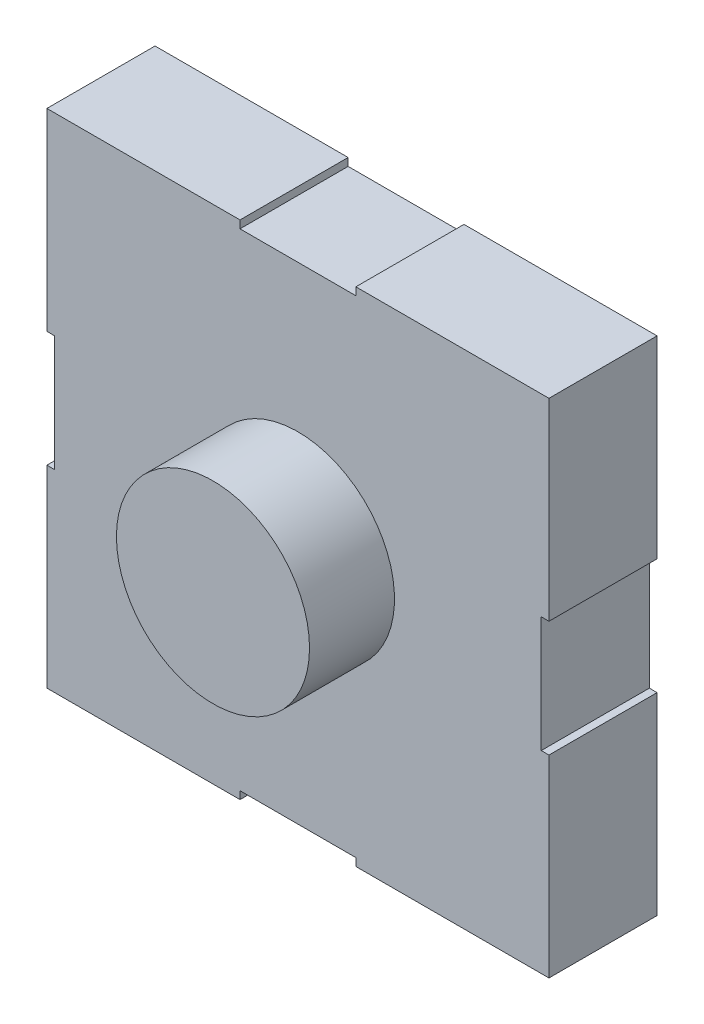
ISO-10303-21;
HEADER;
FILE_DESCRIPTION(('STEP AP214'),'2;1');
FILE_NAME('part.step','',(''),(''),'','','');
FILE_SCHEMA(('AUTOMOTIVE_DESIGN { 1 0 10303 214 1 1 1 1 }'));
ENDSEC;
DATA;
#1=APPLICATION_CONTEXT('core data for automotive mechanical design processes');
#2=APPLICATION_PROTOCOL_DEFINITION('international standard','automotive_design',2000,#1);
#3=PRODUCT_CONTEXT('',#1,'mechanical');
#4=PRODUCT('Part','Part','',(#3));
#5=PRODUCT_RELATED_PRODUCT_CATEGORY('part','',(#4));
#6=PRODUCT_DEFINITION_FORMATION('','',#4);
#7=PRODUCT_DEFINITION_CONTEXT('part definition',#1,'design');
#8=PRODUCT_DEFINITION('design','',#6,#7);
#9=PRODUCT_DEFINITION_SHAPE('','',#8);
#10=(LENGTH_UNIT() NAMED_UNIT(*) SI_UNIT(.MILLI.,.METRE.));
#11=(NAMED_UNIT(*) PLANE_ANGLE_UNIT() SI_UNIT($,.RADIAN.));
#12=(NAMED_UNIT(*) SI_UNIT($,.STERADIAN.) SOLID_ANGLE_UNIT());
#13=UNCERTAINTY_MEASURE_WITH_UNIT(LENGTH_MEASURE(1.E-05),#10,'distance_accuracy_value','');
#14=(GEOMETRIC_REPRESENTATION_CONTEXT(3) GLOBAL_UNCERTAINTY_ASSIGNED_CONTEXT((#13)) GLOBAL_UNIT_ASSIGNED_CONTEXT((#10,
#11,#12)) REPRESENTATION_CONTEXT('',''));
#15=CARTESIAN_POINT('',(0.,0.,0.));
#16=DIRECTION('',(0.,0.,1.));
#17=DIRECTION('',(1.,0.,0.));
#18=AXIS2_PLACEMENT_3D('',#15,#16,#17);
#19=CARTESIAN_POINT('',(3.25000000000001,0.749999999999979,1.4));
#20=DIRECTION('',(-1.,0.,0.));
#21=DIRECTION('',(0.,-1.,0.));
#22=AXIS2_PLACEMENT_3D('',#19,#20,#21);
#23=PLANE('',#22);
#24=DIRECTION('',(0.,1.,0.));
#25=VECTOR('',#24,1.);
#26=CARTESIAN_POINT('',(3.25000000000001,0.749999999999979,0.));
#27=LINE('',#26,#25);
#28=CARTESIAN_POINT('',(3.25000000000001,0.749999999999979,0.));
#29=VERTEX_POINT('',#28);
#30=CARTESIAN_POINT('',(3.25,3.25,0.));
#31=VERTEX_POINT('',#30);
#32=EDGE_CURVE('E203',#29,#31,#27,.T.);
#33=ORIENTED_EDGE('',*,*,#32,.T.);
#34=DIRECTION('',(0.,0.,-1.));
#35=VECTOR('',#34,1.);
#36=CARTESIAN_POINT('',(3.25,3.25,1.4));
#37=LINE('',#36,#35);
#38=CARTESIAN_POINT('',(3.25,3.25,1.4));
#39=VERTEX_POINT('',#38);
#40=EDGE_CURVE('E42',#39,#31,#37,.T.);
#41=ORIENTED_EDGE('',*,*,#40,.F.);
#42=DIRECTION('',(0.,1.,0.));
#43=VECTOR('',#42,1.);
#44=CARTESIAN_POINT('',(3.25000000000001,0.749999999999979,1.4));
#45=LINE('',#44,#43);
#46=CARTESIAN_POINT('',(3.25000000000001,0.749999999999979,1.4));
#47=VERTEX_POINT('',#46);
#48=EDGE_CURVE('E242',#47,#39,#45,.T.);
#49=ORIENTED_EDGE('',*,*,#48,.F.);
#50=DIRECTION('',(0.,0.,-1.));
#51=VECTOR('',#50,1.);
#52=CARTESIAN_POINT('',(3.25000000000001,0.749999999999979,1.4));
#53=LINE('',#52,#51);
#54=EDGE_CURVE('E199',#47,#29,#53,.T.);
#55=ORIENTED_EDGE('',*,*,#54,.T.);
#56=EDGE_LOOP('',(#33,#41,#49,#55));
#57=FACE_BOUND('',#56,.T.);
#58=ADVANCED_FACE('F34',(#57),#23,.F.);
#59=CARTESIAN_POINT('',(0.750000000000009,3.25,1.4));
#60=DIRECTION('',(0.,-1.,0.));
#61=DIRECTION('',(1.,0.,0.));
#62=AXIS2_PLACEMENT_3D('',#59,#60,#61);
#63=PLANE('',#62);
#64=DIRECTION('',(-1.,0.,0.));
#65=VECTOR('',#64,1.);
#66=CARTESIAN_POINT('',(0.750000000000009,3.25,0.));
#67=LINE('',#66,#65);
#68=CARTESIAN_POINT('',(0.750000000000009,3.25,0.));
#69=VERTEX_POINT('',#68);
#70=EDGE_CURVE('E206',#31,#69,#67,.T.);
#71=ORIENTED_EDGE('',*,*,#70,.T.);
#72=DIRECTION('',(0.,0.,-1.));
#73=VECTOR('',#72,1.);
#74=CARTESIAN_POINT('',(0.750000000000009,3.25,1.4));
#75=LINE('',#74,#73);
#76=CARTESIAN_POINT('',(0.750000000000009,3.25,1.4));
#77=VERTEX_POINT('',#76);
#78=EDGE_CURVE('E288',#77,#69,#75,.T.);
#79=ORIENTED_EDGE('',*,*,#78,.F.);
#80=DIRECTION('',(-1.,0.,0.));
#81=VECTOR('',#80,1.);
#82=CARTESIAN_POINT('',(0.750000000000009,3.25,1.4));
#83=LINE('',#82,#81);
#84=EDGE_CURVE('E130',#39,#77,#83,.T.);
#85=ORIENTED_EDGE('',*,*,#84,.F.);
#86=ORIENTED_EDGE('',*,*,#40,.T.);
#87=EDGE_LOOP('',(#71,#79,#85,#86));
#88=FACE_BOUND('',#87,.T.);
#89=ADVANCED_FACE('F291',(#88),#63,.F.);
#90=CARTESIAN_POINT('',(0.750000000000009,3.25,1.4));
#91=DIRECTION('',(1.,0.,0.));
#92=DIRECTION('',(0.,0.,-1.));
#93=AXIS2_PLACEMENT_3D('',#90,#91,#92);
#94=PLANE('',#93);
#95=DIRECTION('',(0.,-1.,0.));
#96=VECTOR('',#95,1.);
#97=CARTESIAN_POINT('',(0.750000000000009,3.25,0.));
#98=LINE('',#97,#96);
#99=CARTESIAN_POINT('',(0.750000000000009,3.15,0.));
#100=VERTEX_POINT('',#99);
#101=EDGE_CURVE('E209',#69,#100,#98,.T.);
#102=ORIENTED_EDGE('',*,*,#101,.T.);
#103=DIRECTION('',(0.,0.,-1.));
#104=VECTOR('',#103,1.);
#105=CARTESIAN_POINT('',(0.750000000000009,3.15,1.4));
#106=LINE('',#105,#104);
#107=CARTESIAN_POINT('',(0.750000000000009,3.15,1.4));
#108=VERTEX_POINT('',#107);
#109=EDGE_CURVE('E285',#108,#100,#106,.T.);
#110=ORIENTED_EDGE('',*,*,#109,.F.);
#111=DIRECTION('',(0.,-1.,0.));
#112=VECTOR('',#111,1.);
#113=CARTESIAN_POINT('',(0.750000000000009,3.25,1.4));
#114=LINE('',#113,#112);
#115=EDGE_CURVE('E311',#77,#108,#114,.T.);
#116=ORIENTED_EDGE('',*,*,#115,.F.);
#117=ORIENTED_EDGE('',*,*,#78,.T.);
#118=EDGE_LOOP('',(#102,#110,#116,#117));
#119=FACE_BOUND('',#118,.T.);
#120=ADVANCED_FACE('F302',(#119),#94,.F.);
#121=CARTESIAN_POINT('',(-0.749999999999991,3.15,1.4));
#122=DIRECTION('',(0.,-1.,0.));
#123=DIRECTION('',(1.,0.,0.));
#124=AXIS2_PLACEMENT_3D('',#121,#122,#123);
#125=PLANE('',#124);
#126=DIRECTION('',(-1.,0.,0.));
#127=VECTOR('',#126,1.);
#128=CARTESIAN_POINT('',(-0.749999999999991,3.15,0.));
#129=LINE('',#128,#127);
#130=CARTESIAN_POINT('',(-0.749999999999991,3.15,0.));
#131=VERTEX_POINT('',#130);
#132=EDGE_CURVE('E211',#100,#131,#129,.T.);
#133=ORIENTED_EDGE('',*,*,#132,.T.);
#134=DIRECTION('',(0.,0.,-1.));
#135=VECTOR('',#134,1.);
#136=CARTESIAN_POINT('',(-0.749999999999991,3.15,1.4));
#137=LINE('',#136,#135);
#138=CARTESIAN_POINT('',(-0.749999999999991,3.15,1.4));
#139=VERTEX_POINT('',#138);
#140=EDGE_CURVE('E282',#139,#131,#137,.T.);
#141=ORIENTED_EDGE('',*,*,#140,.F.);
#142=DIRECTION('',(-1.,0.,0.));
#143=VECTOR('',#142,1.);
#144=CARTESIAN_POINT('',(-0.749999999999991,3.15,1.4));
#145=LINE('',#144,#143);
#146=EDGE_CURVE('E308',#108,#139,#145,.T.);
#147=ORIENTED_EDGE('',*,*,#146,.F.);
#148=ORIENTED_EDGE('',*,*,#109,.T.);
#149=EDGE_LOOP('',(#133,#141,#147,#148));
#150=FACE_BOUND('',#149,.T.);
#151=ADVANCED_FACE('F306',(#150),#125,.F.);
#152=CARTESIAN_POINT('',(-0.74999999999999,3.25,1.4));
#153=DIRECTION('',(-1.,0.,0.));
#154=DIRECTION('',(0.,-1.,0.));
#155=AXIS2_PLACEMENT_3D('',#152,#153,#154);
#156=PLANE('',#155);
#157=DIRECTION('',(0.,1.,0.));
#158=VECTOR('',#157,1.);
#159=CARTESIAN_POINT('',(-0.74999999999999,3.25,0.));
#160=LINE('',#159,#158);
#161=CARTESIAN_POINT('',(-0.74999999999999,3.25,0.));
#162=VERTEX_POINT('',#161);
#163=EDGE_CURVE('E213',#131,#162,#160,.T.);
#164=ORIENTED_EDGE('',*,*,#163,.T.);
#165=DIRECTION('',(0.,0.,-1.));
#166=VECTOR('',#165,1.);
#167=CARTESIAN_POINT('',(-0.74999999999999,3.25,1.4));
#168=LINE('',#167,#166);
#169=CARTESIAN_POINT('',(-0.74999999999999,3.25,1.4));
#170=VERTEX_POINT('',#169);
#171=EDGE_CURVE('E279',#170,#162,#168,.T.);
#172=ORIENTED_EDGE('',*,*,#171,.F.);
#173=DIRECTION('',(0.,1.,0.));
#174=VECTOR('',#173,1.);
#175=CARTESIAN_POINT('',(-0.74999999999999,3.25,1.4));
#176=LINE('',#175,#174);
#177=EDGE_CURVE('E310',#139,#170,#176,.T.);
#178=ORIENTED_EDGE('',*,*,#177,.F.);
#179=ORIENTED_EDGE('',*,*,#140,.T.);
#180=EDGE_LOOP('',(#164,#172,#178,#179));
#181=FACE_BOUND('',#180,.T.);
#182=ADVANCED_FACE('F398',(#181),#156,.F.);
#183=CARTESIAN_POINT('',(-3.25,3.25,1.4));
#184=DIRECTION('',(0.,-1.,0.));
#185=DIRECTION('',(1.,0.,0.));
#186=AXIS2_PLACEMENT_3D('',#183,#184,#185);
#187=PLANE('',#186);
#188=DIRECTION('',(-1.,0.,0.));
#189=VECTOR('',#188,1.);
#190=CARTESIAN_POINT('',(-3.25,3.25,0.));
#191=LINE('',#190,#189);
#192=CARTESIAN_POINT('',(-3.25,3.25,0.));
#193=VERTEX_POINT('',#192);
#194=EDGE_CURVE('E215',#162,#193,#191,.T.);
#195=ORIENTED_EDGE('',*,*,#194,.T.);
#196=DIRECTION('',(0.,0.,-1.));
#197=VECTOR('',#196,1.);
#198=CARTESIAN_POINT('',(-3.25,3.25,1.4));
#199=LINE('',#198,#197);
#200=CARTESIAN_POINT('',(-3.25,3.25,1.4));
#201=VERTEX_POINT('',#200);
#202=EDGE_CURVE('E276',#201,#193,#199,.T.);
#203=ORIENTED_EDGE('',*,*,#202,.F.);
#204=DIRECTION('',(-1.,0.,0.));
#205=VECTOR('',#204,1.);
#206=CARTESIAN_POINT('',(-3.25,3.25,1.4));
#207=LINE('',#206,#205);
#208=EDGE_CURVE('E313',#170,#201,#207,.T.);
#209=ORIENTED_EDGE('',*,*,#208,.F.);
#210=ORIENTED_EDGE('',*,*,#171,.T.);
#211=EDGE_LOOP('',(#195,#203,#209,#210));
#212=FACE_BOUND('',#211,.T.);
#213=ADVANCED_FACE('F394',(#212),#187,.F.);
#214=CARTESIAN_POINT('',(-3.25,0.749999999999998,1.4));
#215=DIRECTION('',(1.,0.,0.));
#216=DIRECTION('',(0.,0.,-1.));
#217=AXIS2_PLACEMENT_3D('',#214,#215,#216);
#218=PLANE('',#217);
#219=DIRECTION('',(0.,-1.,0.));
#220=VECTOR('',#219,1.);
#221=CARTESIAN_POINT('',(-3.25,0.749999999999998,0.));
#222=LINE('',#221,#220);
#223=CARTESIAN_POINT('',(-3.25,0.749999999999998,0.));
#224=VERTEX_POINT('',#223);
#225=EDGE_CURVE('E217',#193,#224,#222,.T.);
#226=ORIENTED_EDGE('',*,*,#225,.T.);
#227=DIRECTION('',(0.,0.,-1.));
#228=VECTOR('',#227,1.);
#229=CARTESIAN_POINT('',(-3.25,0.749999999999998,1.4));
#230=LINE('',#229,#228);
#231=CARTESIAN_POINT('',(-3.25,0.749999999999998,1.4));
#232=VERTEX_POINT('',#231);
#233=EDGE_CURVE('E273',#232,#224,#230,.T.);
#234=ORIENTED_EDGE('',*,*,#233,.F.);
#235=DIRECTION('',(0.,-1.,0.));
#236=VECTOR('',#235,1.);
#237=CARTESIAN_POINT('',(-3.25,0.749999999999998,1.4));
#238=LINE('',#237,#236);
#239=EDGE_CURVE('E319',#201,#232,#238,.T.);
#240=ORIENTED_EDGE('',*,*,#239,.F.);
#241=ORIENTED_EDGE('',*,*,#202,.T.);
#242=EDGE_LOOP('',(#226,#234,#240,#241));
#243=FACE_BOUND('',#242,.T.);
#244=ADVANCED_FACE('F390',(#243),#218,.F.);
#245=CARTESIAN_POINT('',(-3.25,0.749999999999998,1.4));
#246=DIRECTION('',(0.,1.,0.));
#247=DIRECTION('',(-1.,0.,0.));
#248=AXIS2_PLACEMENT_3D('',#245,#246,#247);
#249=PLANE('',#248);
#250=DIRECTION('',(1.,0.,0.));
#251=VECTOR('',#250,1.);
#252=CARTESIAN_POINT('',(-3.25,0.749999999999998,0.));
#253=LINE('',#252,#251);
#254=CARTESIAN_POINT('',(-3.15,0.749999999999998,0.));
#255=VERTEX_POINT('',#254);
#256=EDGE_CURVE('E219',#224,#255,#253,.T.);
#257=ORIENTED_EDGE('',*,*,#256,.T.);
#258=DIRECTION('',(0.,0.,-1.));
#259=VECTOR('',#258,1.);
#260=CARTESIAN_POINT('',(-3.15,0.749999999999998,1.4));
#261=LINE('',#260,#259);
#262=CARTESIAN_POINT('',(-3.15,0.749999999999998,1.4));
#263=VERTEX_POINT('',#262);
#264=EDGE_CURVE('E270',#263,#255,#261,.T.);
#265=ORIENTED_EDGE('',*,*,#264,.F.);
#266=DIRECTION('',(1.,0.,0.));
#267=VECTOR('',#266,1.);
#268=CARTESIAN_POINT('',(-3.25,0.749999999999998,1.4));
#269=LINE('',#268,#267);
#270=EDGE_CURVE('E321',#232,#263,#269,.T.);
#271=ORIENTED_EDGE('',*,*,#270,.F.);
#272=ORIENTED_EDGE('',*,*,#233,.T.);
#273=EDGE_LOOP('',(#257,#265,#271,#272));
#274=FACE_BOUND('',#273,.T.);
#275=ADVANCED_FACE('F386',(#274),#249,.F.);
#276=CARTESIAN_POINT('',(-3.15,-0.750000000000002,1.4));
#277=DIRECTION('',(1.,0.,0.));
#278=DIRECTION('',(0.,0.,-1.));
#279=AXIS2_PLACEMENT_3D('',#276,#277,#278);
#280=PLANE('',#279);
#281=DIRECTION('',(0.,-1.,0.));
#282=VECTOR('',#281,1.);
#283=CARTESIAN_POINT('',(-3.15,-0.750000000000002,0.));
#284=LINE('',#283,#282);
#285=CARTESIAN_POINT('',(-3.15,-0.750000000000002,0.));
#286=VERTEX_POINT('',#285);
#287=EDGE_CURVE('E221',#255,#286,#284,.T.);
#288=ORIENTED_EDGE('',*,*,#287,.T.);
#289=DIRECTION('',(0.,0.,-1.));
#290=VECTOR('',#289,1.);
#291=CARTESIAN_POINT('',(-3.15,-0.750000000000002,1.4));
#292=LINE('',#291,#290);
#293=CARTESIAN_POINT('',(-3.15,-0.750000000000002,1.4));
#294=VERTEX_POINT('',#293);
#295=EDGE_CURVE('E267',#294,#286,#292,.T.);
#296=ORIENTED_EDGE('',*,*,#295,.F.);
#297=DIRECTION('',(0.,-1.,0.));
#298=VECTOR('',#297,1.);
#299=CARTESIAN_POINT('',(-3.15,-0.750000000000002,1.4));
#300=LINE('',#299,#298);
#301=EDGE_CURVE('E323',#263,#294,#300,.T.);
#302=ORIENTED_EDGE('',*,*,#301,.F.);
#303=ORIENTED_EDGE('',*,*,#264,.T.);
#304=EDGE_LOOP('',(#288,#296,#302,#303));
#305=FACE_BOUND('',#304,.T.);
#306=ADVANCED_FACE('F381',(#305),#280,.F.);
#307=CARTESIAN_POINT('',(-3.25,-0.750000000000002,1.4));
#308=DIRECTION('',(0.,-1.,0.));
#309=DIRECTION('',(0.,0.,-1.));
#310=AXIS2_PLACEMENT_3D('',#307,#308,#309);
#311=PLANE('',#310);
#312=DIRECTION('',(-1.,0.,0.));
#313=VECTOR('',#312,1.);
#314=CARTESIAN_POINT('',(-3.25,-0.750000000000002,0.));
#315=LINE('',#314,#313);
#316=CARTESIAN_POINT('',(-3.25,-0.750000000000002,0.));
#317=VERTEX_POINT('',#316);
#318=EDGE_CURVE('E223',#286,#317,#315,.T.);
#319=ORIENTED_EDGE('',*,*,#318,.T.);
#320=DIRECTION('',(0.,0.,-1.));
#321=VECTOR('',#320,1.);
#322=CARTESIAN_POINT('',(-3.25,-0.750000000000002,1.4));
#323=LINE('',#322,#321);
#324=CARTESIAN_POINT('',(-3.25,-0.750000000000002,1.4));
#325=VERTEX_POINT('',#324);
#326=EDGE_CURVE('E264',#325,#317,#323,.T.);
#327=ORIENTED_EDGE('',*,*,#326,.F.);
#328=DIRECTION('',(-1.,0.,0.));
#329=VECTOR('',#328,1.);
#330=CARTESIAN_POINT('',(-3.25,-0.750000000000002,1.4));
#331=LINE('',#330,#329);
#332=EDGE_CURVE('E325',#294,#325,#331,.T.);
#333=ORIENTED_EDGE('',*,*,#332,.F.);
#334=ORIENTED_EDGE('',*,*,#295,.T.);
#335=EDGE_LOOP('',(#319,#327,#333,#334));
#336=FACE_BOUND('',#335,.T.);
#337=ADVANCED_FACE('F375',(#336),#311,.F.);
#338=CARTESIAN_POINT('',(-3.25,-3.25,1.4));
#339=DIRECTION('',(1.,0.,0.));
#340=DIRECTION('',(0.,1.,0.));
#341=AXIS2_PLACEMENT_3D('',#338,#339,#340);
#342=PLANE('',#341);
#343=DIRECTION('',(0.,-1.,0.));
#344=VECTOR('',#343,1.);
#345=CARTESIAN_POINT('',(-3.25,-3.25,0.));
#346=LINE('',#345,#344);
#347=CARTESIAN_POINT('',(-3.25,-3.25,0.));
#348=VERTEX_POINT('',#347);
#349=EDGE_CURVE('E225',#317,#348,#346,.T.);
#350=ORIENTED_EDGE('',*,*,#349,.T.);
#351=DIRECTION('',(0.,0.,-1.));
#352=VECTOR('',#351,1.);
#353=CARTESIAN_POINT('',(-3.25,-3.25,1.4));
#354=LINE('',#353,#352);
#355=CARTESIAN_POINT('',(-3.25,-3.25,1.4));
#356=VERTEX_POINT('',#355);
#357=EDGE_CURVE('E261',#356,#348,#354,.T.);
#358=ORIENTED_EDGE('',*,*,#357,.F.);
#359=DIRECTION('',(0.,-1.,0.));
#360=VECTOR('',#359,1.);
#361=CARTESIAN_POINT('',(-3.25,-3.25,1.4));
#362=LINE('',#361,#360);
#363=EDGE_CURVE('E327',#325,#356,#362,.T.);
#364=ORIENTED_EDGE('',*,*,#363,.F.);
#365=ORIENTED_EDGE('',*,*,#326,.T.);
#366=EDGE_LOOP('',(#350,#358,#364,#365));
#367=FACE_BOUND('',#366,.T.);
#368=ADVANCED_FACE('F371',(#367),#342,.F.);
#369=CARTESIAN_POINT('',(-3.25,-3.25,1.4));
#370=DIRECTION('',(0.,1.,0.));
#371=DIRECTION('',(-1.,0.,0.));
#372=AXIS2_PLACEMENT_3D('',#369,#370,#371);
#373=PLANE('',#372);
#374=DIRECTION('',(1.,0.,0.));
#375=VECTOR('',#374,1.);
#376=CARTESIAN_POINT('',(-3.25,-3.25,0.));
#377=LINE('',#376,#375);
#378=CARTESIAN_POINT('',(-0.750000000000032,-3.24999999999999,0.));
#379=VERTEX_POINT('',#378);
#380=EDGE_CURVE('E227',#348,#379,#377,.T.);
#381=ORIENTED_EDGE('',*,*,#380,.T.);
#382=DIRECTION('',(0.,0.,-1.));
#383=VECTOR('',#382,1.);
#384=CARTESIAN_POINT('',(-0.750000000000032,-3.24999999999999,1.4));
#385=LINE('',#384,#383);
#386=CARTESIAN_POINT('',(-0.750000000000032,-3.24999999999999,1.4));
#387=VERTEX_POINT('',#386);
#388=EDGE_CURVE('E258',#387,#379,#385,.T.);
#389=ORIENTED_EDGE('',*,*,#388,.F.);
#390=DIRECTION('',(1.,0.,0.));
#391=VECTOR('',#390,1.);
#392=CARTESIAN_POINT('',(-3.25,-3.25,1.4));
#393=LINE('',#392,#391);
#394=EDGE_CURVE('E329',#356,#387,#393,.T.);
#395=ORIENTED_EDGE('',*,*,#394,.F.);
#396=ORIENTED_EDGE('',*,*,#357,.T.);
#397=EDGE_LOOP('',(#381,#389,#395,#396));
#398=FACE_BOUND('',#397,.T.);
#399=ADVANCED_FACE('F366',(#398),#373,.F.);
#400=CARTESIAN_POINT('',(-0.750000000000032,-3.24999999999999,1.4));
#401=DIRECTION('',(-1.,0.,0.));
#402=DIRECTION('',(0.,-1.,0.));
#403=AXIS2_PLACEMENT_3D('',#400,#401,#402);
#404=PLANE('',#403);
#405=DIRECTION('',(0.,1.,0.));
#406=VECTOR('',#405,1.);
#407=CARTESIAN_POINT('',(-0.750000000000032,-3.24999999999999,0.));
#408=LINE('',#407,#406);
#409=CARTESIAN_POINT('',(-0.750000000000031,-3.14999999999999,0.));
#410=VERTEX_POINT('',#409);
#411=EDGE_CURVE('E229',#379,#410,#408,.T.);
#412=ORIENTED_EDGE('',*,*,#411,.T.);
#413=DIRECTION('',(0.,0.,-1.));
#414=VECTOR('',#413,1.);
#415=CARTESIAN_POINT('',(-0.750000000000031,-3.14999999999999,1.4));
#416=LINE('',#415,#414);
#417=CARTESIAN_POINT('',(-0.750000000000031,-3.14999999999999,1.4));
#418=VERTEX_POINT('',#417);
#419=EDGE_CURVE('E255',#418,#410,#416,.T.);
#420=ORIENTED_EDGE('',*,*,#419,.F.);
#421=DIRECTION('',(0.,1.,0.));
#422=VECTOR('',#421,1.);
#423=CARTESIAN_POINT('',(-0.750000000000032,-3.24999999999999,1.4));
#424=LINE('',#423,#422);
#425=EDGE_CURVE('E331',#387,#418,#424,.T.);
#426=ORIENTED_EDGE('',*,*,#425,.F.);
#427=ORIENTED_EDGE('',*,*,#388,.T.);
#428=EDGE_LOOP('',(#412,#420,#426,#427));
#429=FACE_BOUND('',#428,.T.);
#430=ADVANCED_FACE('F360',(#429),#404,.F.);
#431=CARTESIAN_POINT('',(0.749999999999969,-3.15000000000001,1.4));
#432=DIRECTION('',(0.,1.,0.));
#433=DIRECTION('',(-1.,0.,0.));
#434=AXIS2_PLACEMENT_3D('',#431,#432,#433);
#435=PLANE('',#434);
#436=DIRECTION('',(1.,0.,0.));
#437=VECTOR('',#436,1.);
#438=CARTESIAN_POINT('',(0.749999999999969,-3.15000000000001,0.));
#439=LINE('',#438,#437);
#440=CARTESIAN_POINT('',(0.749999999999969,-3.15000000000001,0.));
#441=VERTEX_POINT('',#440);
#442=EDGE_CURVE('E231',#410,#441,#439,.T.);
#443=ORIENTED_EDGE('',*,*,#442,.T.);
#444=DIRECTION('',(0.,0.,-1.));
#445=VECTOR('',#444,1.);
#446=CARTESIAN_POINT('',(0.749999999999969,-3.15000000000001,1.4));
#447=LINE('',#446,#445);
#448=CARTESIAN_POINT('',(0.749999999999969,-3.15000000000001,1.4));
#449=VERTEX_POINT('',#448);
#450=EDGE_CURVE('E252',#449,#441,#447,.T.);
#451=ORIENTED_EDGE('',*,*,#450,.F.);
#452=DIRECTION('',(1.,0.,0.));
#453=VECTOR('',#452,1.);
#454=CARTESIAN_POINT('',(0.749999999999969,-3.15000000000001,1.4));
#455=LINE('',#454,#453);
#456=EDGE_CURVE('E333',#418,#449,#455,.T.);
#457=ORIENTED_EDGE('',*,*,#456,.F.);
#458=ORIENTED_EDGE('',*,*,#419,.T.);
#459=EDGE_LOOP('',(#443,#451,#457,#458));
#460=FACE_BOUND('',#459,.T.);
#461=ADVANCED_FACE('F356',(#460),#435,.F.);
#462=CARTESIAN_POINT('',(0.749999999999967,-3.25000000000001,1.4));
#463=DIRECTION('',(1.,0.,0.));
#464=DIRECTION('',(0.,1.,0.));
#465=AXIS2_PLACEMENT_3D('',#462,#463,#464);
#466=PLANE('',#465);
#467=DIRECTION('',(0.,-1.,0.));
#468=VECTOR('',#467,1.);
#469=CARTESIAN_POINT('',(0.749999999999967,-3.25000000000001,0.));
#470=LINE('',#469,#468);
#471=CARTESIAN_POINT('',(0.749999999999967,-3.25000000000001,0.));
#472=VERTEX_POINT('',#471);
#473=EDGE_CURVE('E233',#441,#472,#470,.T.);
#474=ORIENTED_EDGE('',*,*,#473,.T.);
#475=DIRECTION('',(0.,0.,-1.));
#476=VECTOR('',#475,1.);
#477=CARTESIAN_POINT('',(0.749999999999967,-3.25000000000001,1.4));
#478=LINE('',#477,#476);
#479=CARTESIAN_POINT('',(0.749999999999967,-3.25000000000001,1.4));
#480=VERTEX_POINT('',#479);
#481=EDGE_CURVE('E249',#480,#472,#478,.T.);
#482=ORIENTED_EDGE('',*,*,#481,.F.);
#483=DIRECTION('',(0.,-1.,0.));
#484=VECTOR('',#483,1.);
#485=CARTESIAN_POINT('',(0.749999999999967,-3.25000000000001,1.4));
#486=LINE('',#485,#484);
#487=EDGE_CURVE('E335',#449,#480,#486,.T.);
#488=ORIENTED_EDGE('',*,*,#487,.F.);
#489=ORIENTED_EDGE('',*,*,#450,.T.);
#490=EDGE_LOOP('',(#474,#482,#488,#489));
#491=FACE_BOUND('',#490,.T.);
#492=ADVANCED_FACE('F352',(#491),#466,.F.);
#493=CARTESIAN_POINT('',(0.749999999999967,-3.25000000000001,1.4));
#494=DIRECTION('',(0.,1.,0.));
#495=DIRECTION('',(-1.,0.,0.));
#496=AXIS2_PLACEMENT_3D('',#493,#494,#495);
#497=PLANE('',#496);
#498=DIRECTION('',(1.,0.,0.));
#499=VECTOR('',#498,1.);
#500=CARTESIAN_POINT('',(0.749999999999967,-3.25000000000001,0.));
#501=LINE('',#500,#499);
#502=CARTESIAN_POINT('',(3.25,-3.25,0.));
#503=VERTEX_POINT('',#502);
#504=EDGE_CURVE('E235',#472,#503,#501,.T.);
#505=ORIENTED_EDGE('',*,*,#504,.T.);
#506=DIRECTION('',(0.,0.,-1.));
#507=VECTOR('',#506,1.);
#508=CARTESIAN_POINT('',(3.25,-3.25,1.4));
#509=LINE('',#508,#507);
#510=CARTESIAN_POINT('',(3.25,-3.25,1.4));
#511=VERTEX_POINT('',#510);
#512=EDGE_CURVE('E246',#511,#503,#509,.T.);
#513=ORIENTED_EDGE('',*,*,#512,.F.);
#514=DIRECTION('',(1.,0.,0.));
#515=VECTOR('',#514,1.);
#516=CARTESIAN_POINT('',(0.749999999999967,-3.25000000000001,1.4));
#517=LINE('',#516,#515);
#518=EDGE_CURVE('E337',#480,#511,#517,.T.);
#519=ORIENTED_EDGE('',*,*,#518,.F.);
#520=ORIENTED_EDGE('',*,*,#481,.T.);
#521=EDGE_LOOP('',(#505,#513,#519,#520));
#522=FACE_BOUND('',#521,.T.);
#523=ADVANCED_FACE('F343',(#522),#497,.F.);
#524=CARTESIAN_POINT('',(3.25,-3.25,1.4));
#525=DIRECTION('',(-1.,0.,0.));
#526=DIRECTION('',(0.,-1.,0.));
#527=AXIS2_PLACEMENT_3D('',#524,#525,#526);
#528=PLANE('',#527);
#529=DIRECTION('',(0.,1.,0.));
#530=VECTOR('',#529,1.);
#531=CARTESIAN_POINT('',(3.25,-3.25,0.));
#532=LINE('',#531,#530);
#533=CARTESIAN_POINT('',(3.24999999999999,-0.750000000000021,0.));
#534=VERTEX_POINT('',#533);
#535=EDGE_CURVE('E237',#503,#534,#532,.T.);
#536=ORIENTED_EDGE('',*,*,#535,.T.);
#537=DIRECTION('',(0.,0.,-1.));
#538=VECTOR('',#537,1.);
#539=CARTESIAN_POINT('',(3.24999999999999,-0.750000000000021,1.4));
#540=LINE('',#539,#538);
#541=CARTESIAN_POINT('',(3.24999999999999,-0.750000000000021,1.4));
#542=VERTEX_POINT('',#541);
#543=EDGE_CURVE('E194',#542,#534,#540,.T.);
#544=ORIENTED_EDGE('',*,*,#543,.F.);
#545=DIRECTION('',(0.,1.,0.));
#546=VECTOR('',#545,1.);
#547=CARTESIAN_POINT('',(3.25,-3.25,1.4));
#548=LINE('',#547,#546);
#549=EDGE_CURVE('E185',#511,#542,#548,.T.);
#550=ORIENTED_EDGE('',*,*,#549,.F.);
#551=ORIENTED_EDGE('',*,*,#512,.T.);
#552=EDGE_LOOP('',(#536,#544,#550,#551));
#553=FACE_BOUND('',#552,.T.);
#554=ADVANCED_FACE('F347',(#553),#528,.F.);
#555=CARTESIAN_POINT('',(3.24999999999999,-0.750000000000021,1.4));
#556=DIRECTION('',(0.,-1.,0.));
#557=DIRECTION('',(1.,0.,0.));
#558=AXIS2_PLACEMENT_3D('',#555,#556,#557);
#559=PLANE('',#558);
#560=DIRECTION('',(-1.,0.,0.));
#561=VECTOR('',#560,1.);
#562=CARTESIAN_POINT('',(3.24999999999999,-0.750000000000021,0.));
#563=LINE('',#562,#561);
#564=CARTESIAN_POINT('',(3.14999999999999,-0.75000000000002,0.));
#565=VERTEX_POINT('',#564);
#566=EDGE_CURVE('E193',#534,#565,#563,.T.);
#567=ORIENTED_EDGE('',*,*,#566,.T.);
#568=DIRECTION('',(0.,0.,-1.));
#569=VECTOR('',#568,1.);
#570=CARTESIAN_POINT('',(3.14999999999999,-0.75000000000002,1.4));
#571=LINE('',#570,#569);
#572=CARTESIAN_POINT('',(3.14999999999999,-0.75000000000002,1.4));
#573=VERTEX_POINT('',#572);
#574=EDGE_CURVE('E190',#573,#565,#571,.T.);
#575=ORIENTED_EDGE('',*,*,#574,.F.);
#576=DIRECTION('',(-1.,0.,0.));
#577=VECTOR('',#576,1.);
#578=CARTESIAN_POINT('',(3.24999999999999,-0.750000000000021,1.4));
#579=LINE('',#578,#577);
#580=EDGE_CURVE('E179',#542,#573,#579,.T.);
#581=ORIENTED_EDGE('',*,*,#580,.F.);
#582=ORIENTED_EDGE('',*,*,#543,.T.);
#583=EDGE_LOOP('',(#567,#575,#581,#582));
#584=FACE_BOUND('',#583,.T.);
#585=ADVANCED_FACE('F191',(#584),#559,.F.);
#586=CARTESIAN_POINT('',(3.15,0.74999999999998,1.4));
#587=DIRECTION('',(-1.,0.,0.));
#588=DIRECTION('',(0.,-1.,0.));
#589=AXIS2_PLACEMENT_3D('',#586,#587,#588);
#590=PLANE('',#589);
#591=DIRECTION('',(0.,1.,0.));
#592=VECTOR('',#591,1.);
#593=CARTESIAN_POINT('',(3.15,0.74999999999998,0.));
#594=LINE('',#593,#592);
#595=CARTESIAN_POINT('',(3.15,0.74999999999998,0.));
#596=VERTEX_POINT('',#595);
#597=EDGE_CURVE('E115',#565,#596,#594,.T.);
#598=ORIENTED_EDGE('',*,*,#597,.T.);
#599=DIRECTION('',(0.,0.,-1.));
#600=VECTOR('',#599,1.);
#601=CARTESIAN_POINT('',(3.15,0.74999999999998,1.4));
#602=LINE('',#601,#600);
#603=CARTESIAN_POINT('',(3.15,0.74999999999998,1.4));
#604=VERTEX_POINT('',#603);
#605=EDGE_CURVE('E195',#604,#596,#602,.T.);
#606=ORIENTED_EDGE('',*,*,#605,.F.);
#607=DIRECTION('',(0.,1.,0.));
#608=VECTOR('',#607,1.);
#609=CARTESIAN_POINT('',(3.15,0.74999999999998,1.4));
#610=LINE('',#609,#608);
#611=EDGE_CURVE('E183',#573,#604,#610,.T.);
#612=ORIENTED_EDGE('',*,*,#611,.F.);
#613=ORIENTED_EDGE('',*,*,#574,.T.);
#614=EDGE_LOOP('',(#598,#606,#612,#613));
#615=FACE_BOUND('',#614,.T.);
#616=ADVANCED_FACE('F197',(#615),#590,.F.);
#617=CARTESIAN_POINT('',(3.25000000000001,0.749999999999979,1.4));
#618=DIRECTION('',(0.,1.,0.));
#619=DIRECTION('',(-1.,0.,0.));
#620=AXIS2_PLACEMENT_3D('',#617,#618,#619);
#621=PLANE('',#620);
#622=DIRECTION('',(1.,0.,0.));
#623=VECTOR('',#622,1.);
#624=CARTESIAN_POINT('',(3.25000000000001,0.749999999999979,0.));
#625=LINE('',#624,#623);
#626=EDGE_CURVE('E121',#596,#29,#625,.T.);
#627=ORIENTED_EDGE('',*,*,#626,.T.);
#628=ORIENTED_EDGE('',*,*,#54,.F.);
#629=DIRECTION('',(1.,0.,0.));
#630=VECTOR('',#629,1.);
#631=CARTESIAN_POINT('',(3.25000000000001,0.749999999999979,1.4));
#632=LINE('',#631,#630);
#633=EDGE_CURVE('E50',#604,#47,#632,.T.);
#634=ORIENTED_EDGE('',*,*,#633,.F.);
#635=ORIENTED_EDGE('',*,*,#605,.T.);
#636=EDGE_LOOP('',(#627,#628,#634,#635));
#637=FACE_BOUND('',#636,.T.);
#638=ADVANCED_FACE('F536',(#637),#621,.F.);
#639=CARTESIAN_POINT('',(0.,0.,1.4));
#640=DIRECTION('',(0.,0.,-1.));
#641=DIRECTION('',(-1.,0.,0.));
#642=AXIS2_PLACEMENT_3D('',#639,#640,#641);
#643=PLANE('',#642);
#644=CARTESIAN_POINT('',(0.,0.,1.4));
#645=DIRECTION('',(0.,0.,-1.));
#646=DIRECTION('',(-1.,0.,0.));
#647=AXIS2_PLACEMENT_3D('',#644,#645,#646);
#648=CIRCLE('',#647,1.25);
#649=CARTESIAN_POINT('',(-1.25,0.,1.4));
#650=VERTEX_POINT('',#649);
#651=EDGE_CURVE('E11',#650,#650,#648,.F.);
#652=ORIENTED_EDGE('',*,*,#651,.F.);
#653=EDGE_LOOP('',(#652));
#654=FACE_BOUND('',#653,.T.);
#655=ORIENTED_EDGE('',*,*,#48,.T.);
#656=ORIENTED_EDGE('',*,*,#84,.T.);
#657=ORIENTED_EDGE('',*,*,#115,.T.);
#658=ORIENTED_EDGE('',*,*,#146,.T.);
#659=ORIENTED_EDGE('',*,*,#177,.T.);
#660=ORIENTED_EDGE('',*,*,#208,.T.);
#661=ORIENTED_EDGE('',*,*,#239,.T.);
#662=ORIENTED_EDGE('',*,*,#270,.T.);
#663=ORIENTED_EDGE('',*,*,#301,.T.);
#664=ORIENTED_EDGE('',*,*,#332,.T.);
#665=ORIENTED_EDGE('',*,*,#363,.T.);
#666=ORIENTED_EDGE('',*,*,#394,.T.);
#667=ORIENTED_EDGE('',*,*,#425,.T.);
#668=ORIENTED_EDGE('',*,*,#456,.T.);
#669=ORIENTED_EDGE('',*,*,#487,.T.);
#670=ORIENTED_EDGE('',*,*,#518,.T.);
#671=ORIENTED_EDGE('',*,*,#549,.T.);
#672=ORIENTED_EDGE('',*,*,#580,.T.);
#673=ORIENTED_EDGE('',*,*,#611,.T.);
#674=ORIENTED_EDGE('',*,*,#633,.T.);
#675=EDGE_LOOP('',(#655,#656,#657,#658,#659,#660,#661,#662,#663,#664,#665,#666,#667,#668,#669,
#670,#671,#672,#673,#674));
#676=FACE_BOUND('',#675,.T.);
#677=ADVANCED_FACE('F181',(#654,#676),#643,.F.);
#678=CARTESIAN_POINT('',(0.,0.,0.));
#679=DIRECTION('',(0.,0.,-1.));
#680=DIRECTION('',(-1.,0.,0.));
#681=AXIS2_PLACEMENT_3D('',#678,#679,#680);
#682=PLANE('',#681);
#683=ORIENTED_EDGE('',*,*,#32,.F.);
#684=ORIENTED_EDGE('',*,*,#626,.F.);
#685=ORIENTED_EDGE('',*,*,#597,.F.);
#686=ORIENTED_EDGE('',*,*,#566,.F.);
#687=ORIENTED_EDGE('',*,*,#535,.F.);
#688=ORIENTED_EDGE('',*,*,#504,.F.);
#689=ORIENTED_EDGE('',*,*,#473,.F.);
#690=ORIENTED_EDGE('',*,*,#442,.F.);
#691=ORIENTED_EDGE('',*,*,#411,.F.);
#692=ORIENTED_EDGE('',*,*,#380,.F.);
#693=ORIENTED_EDGE('',*,*,#349,.F.);
#694=ORIENTED_EDGE('',*,*,#318,.F.);
#695=ORIENTED_EDGE('',*,*,#287,.F.);
#696=ORIENTED_EDGE('',*,*,#256,.F.);
#697=ORIENTED_EDGE('',*,*,#225,.F.);
#698=ORIENTED_EDGE('',*,*,#194,.F.);
#699=ORIENTED_EDGE('',*,*,#163,.F.);
#700=ORIENTED_EDGE('',*,*,#132,.F.);
#701=ORIENTED_EDGE('',*,*,#101,.F.);
#702=ORIENTED_EDGE('',*,*,#70,.F.);
#703=EDGE_LOOP('',(#683,#684,#685,#686,#687,#688,#689,#690,#691,#692,#693,#694,#695,#696,#697,
#698,#699,#700,#701,#702));
#704=FACE_BOUND('',#703,.T.);
#705=ADVANCED_FACE('F296',(#704),#682,.T.);
#706=CARTESIAN_POINT('',(0.,0.,2.5));
#707=DIRECTION('',(0.,0.,-1.));
#708=DIRECTION('',(-1.,0.,0.));
#709=AXIS2_PLACEMENT_3D('',#706,#707,#708);
#710=CYLINDRICAL_SURFACE('',#709,1.25);
#711=CARTESIAN_POINT('',(0.,0.,2.5));
#712=DIRECTION('',(0.,0.,1.));
#713=DIRECTION('',(1.,0.,0.));
#714=AXIS2_PLACEMENT_3D('',#711,#712,#713);
#715=CIRCLE('',#714,1.25);
#716=CARTESIAN_POINT('',(1.25,0.,2.5));
#717=VERTEX_POINT('',#716);
#718=EDGE_CURVE('E207',#717,#717,#715,.T.);
#719=ORIENTED_EDGE('',*,*,#718,.F.);
#720=EDGE_LOOP('',(#719));
#721=FACE_BOUND('',#720,.T.);
#722=ORIENTED_EDGE('',*,*,#651,.T.);
#723=EDGE_LOOP('',(#722));
#724=FACE_BOUND('',#723,.T.);
#725=ADVANCED_FACE('F555',(#721,#724),#710,.T.);
#726=CARTESIAN_POINT('',(0.,0.,2.5));
#727=DIRECTION('',(0.,0.,1.));
#728=DIRECTION('',(1.,0.,0.));
#729=AXIS2_PLACEMENT_3D('',#726,#727,#728);
#730=PLANE('',#729);
#731=ORIENTED_EDGE('',*,*,#718,.T.);
#732=EDGE_LOOP('',(#731));
#733=FACE_BOUND('',#732,.T.);
#734=ADVANCED_FACE('F572',(#733),#730,.T.);
#735=CLOSED_SHELL('',(#58,#89,#120,#151,#182,#213,#244,#275,#306,#337,#368,#399,#430,#461,#492,
#523,#554,#585,#616,#638,#677,#705,#725,#734));
#736=MANIFOLD_SOLID_BREP('B2',#735);
#737=ADVANCED_BREP_SHAPE_REPRESENTATION('',(#18,#736),#14);
#738=SHAPE_DEFINITION_REPRESENTATION(#9,#737);
ENDSEC;
END-ISO-10303-21;
